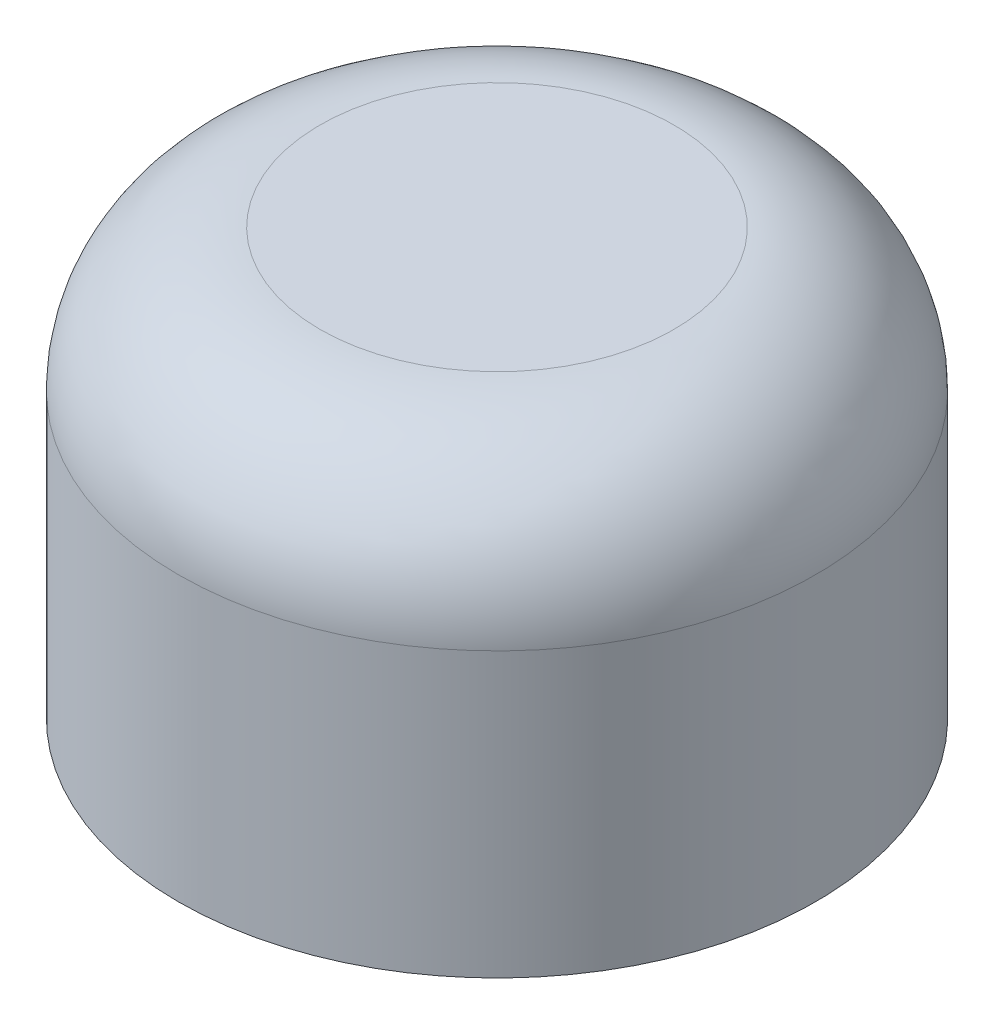
ISO-10303-21;
HEADER;
FILE_DESCRIPTION(('STEP AP214'),'2;1');
FILE_NAME('part.step','',(''),(''),'','','');
FILE_SCHEMA(('AUTOMOTIVE_DESIGN { 1 0 10303 214 1 1 1 1 }'));
ENDSEC;
DATA;
#1=APPLICATION_CONTEXT('core data for automotive mechanical design processes');
#2=APPLICATION_PROTOCOL_DEFINITION('international standard','automotive_design',2000,#1);
#3=PRODUCT_CONTEXT('',#1,'mechanical');
#4=PRODUCT('Part','Part','',(#3));
#5=PRODUCT_RELATED_PRODUCT_CATEGORY('part','',(#4));
#6=PRODUCT_DEFINITION_FORMATION('','',#4);
#7=PRODUCT_DEFINITION_CONTEXT('part definition',#1,'design');
#8=PRODUCT_DEFINITION('design','',#6,#7);
#9=PRODUCT_DEFINITION_SHAPE('','',#8);
#10=(LENGTH_UNIT() NAMED_UNIT(*) SI_UNIT(.MILLI.,.METRE.));
#11=(NAMED_UNIT(*) PLANE_ANGLE_UNIT() SI_UNIT($,.RADIAN.));
#12=(NAMED_UNIT(*) SI_UNIT($,.STERADIAN.) SOLID_ANGLE_UNIT());
#13=UNCERTAINTY_MEASURE_WITH_UNIT(LENGTH_MEASURE(1.E-05),#10,'distance_accuracy_value','');
#14=(GEOMETRIC_REPRESENTATION_CONTEXT(3) GLOBAL_UNCERTAINTY_ASSIGNED_CONTEXT((#13)) GLOBAL_UNIT_ASSIGNED_CONTEXT((#10,
#11,#12)) REPRESENTATION_CONTEXT('',''));
#15=CARTESIAN_POINT('',(0.,0.,0.));
#16=DIRECTION('',(0.,0.,1.));
#17=DIRECTION('',(1.,0.,0.));
#18=AXIS2_PLACEMENT_3D('',#15,#16,#17);
#19=CARTESIAN_POINT('',(0.,15.,0.));
#20=DIRECTION('',(0.,-1.,0.));
#21=DIRECTION('',(0.,0.,-1.));
#22=AXIS2_PLACEMENT_3D('',#19,#20,#21);
#23=CYLINDRICAL_SURFACE('',#22,11.25);
#24=CARTESIAN_POINT('',(0.,10.,0.));
#25=DIRECTION('',(0.,1.,0.));
#26=DIRECTION('',(0.,0.,1.));
#27=AXIS2_PLACEMENT_3D('',#24,#25,#26);
#28=CIRCLE('',#27,11.25);
#29=CARTESIAN_POINT('',(0.,10.,11.25));
#30=VERTEX_POINT('',#29);
#31=EDGE_CURVE('E11',#30,#30,#28,.F.);
#32=ORIENTED_EDGE('',*,*,#31,.T.);
#33=EDGE_LOOP('',(#32));
#34=FACE_BOUND('',#33,.T.);
#35=CARTESIAN_POINT('',(0.,0.,0.));
#36=DIRECTION('',(0.,1.,0.));
#37=DIRECTION('',(0.,0.,1.));
#38=AXIS2_PLACEMENT_3D('',#35,#36,#37);
#39=CIRCLE('',#38,11.25);
#40=CARTESIAN_POINT('',(0.,0.,11.25));
#41=VERTEX_POINT('',#40);
#42=EDGE_CURVE('E111',#41,#41,#39,.T.);
#43=ORIENTED_EDGE('',*,*,#42,.T.);
#44=EDGE_LOOP('',(#43));
#45=FACE_BOUND('',#44,.T.);
#46=ADVANCED_FACE('F35',(#34,#45),#23,.T.);
#47=CARTESIAN_POINT('',(0.,15.,0.));
#48=DIRECTION('',(0.,1.,0.));
#49=DIRECTION('',(0.,0.,1.));
#50=AXIS2_PLACEMENT_3D('',#47,#48,#49);
#51=PLANE('',#50);
#52=CARTESIAN_POINT('',(0.,15.,0.));
#53=DIRECTION('',(0.,1.,0.));
#54=DIRECTION('',(0.,0.,1.));
#55=AXIS2_PLACEMENT_3D('',#52,#53,#54);
#56=CIRCLE('',#55,6.25);
#57=CARTESIAN_POINT('',(0.,15.,6.25));
#58=VERTEX_POINT('',#57);
#59=EDGE_CURVE('E43',#58,#58,#56,.T.);
#60=ORIENTED_EDGE('',*,*,#59,.T.);
#61=EDGE_LOOP('',(#60));
#62=FACE_BOUND('',#61,.T.);
#63=ADVANCED_FACE('F118',(#62),#51,.T.);
#64=CARTESIAN_POINT('',(0.,0.,0.));
#65=DIRECTION('',(0.,1.,0.));
#66=DIRECTION('',(0.,0.,1.));
#67=AXIS2_PLACEMENT_3D('',#64,#65,#66);
#68=PLANE('',#67);
#69=DIRECTION('',(-1.,0.,0.));
#70=VECTOR('',#69,1.);
#71=CARTESIAN_POINT('',(-3.65,0.,3.65));
#72=LINE('',#71,#70);
#73=CARTESIAN_POINT('',(3.65,0.,3.65));
#74=VERTEX_POINT('',#73);
#75=CARTESIAN_POINT('',(-3.65,0.,3.65));
#76=VERTEX_POINT('',#75);
#77=EDGE_CURVE('E85',#74,#76,#72,.T.);
#78=ORIENTED_EDGE('',*,*,#77,.F.);
#79=DIRECTION('',(0.,0.,1.));
#80=VECTOR('',#79,1.);
#81=CARTESIAN_POINT('',(3.65,0.,-3.65));
#82=LINE('',#81,#80);
#83=CARTESIAN_POINT('',(3.65,0.,-3.65));
#84=VERTEX_POINT('',#83);
#85=EDGE_CURVE('E50',#84,#74,#82,.T.);
#86=ORIENTED_EDGE('',*,*,#85,.F.);
#87=DIRECTION('',(1.,0.,0.));
#88=VECTOR('',#87,1.);
#89=CARTESIAN_POINT('',(-3.65,0.,-3.65));
#90=LINE('',#89,#88);
#91=CARTESIAN_POINT('',(-3.65,0.,-3.65));
#92=VERTEX_POINT('',#91);
#93=EDGE_CURVE('E101',#92,#84,#90,.T.);
#94=ORIENTED_EDGE('',*,*,#93,.F.);
#95=DIRECTION('',(0.,0.,-1.));
#96=VECTOR('',#95,1.);
#97=CARTESIAN_POINT('',(-3.65,0.,-3.65));
#98=LINE('',#97,#96);
#99=EDGE_CURVE('E107',#76,#92,#98,.T.);
#100=ORIENTED_EDGE('',*,*,#99,.F.);
#101=EDGE_LOOP('',(#78,#86,#94,#100));
#102=FACE_BOUND('',#101,.T.);
#103=ORIENTED_EDGE('',*,*,#42,.F.);
#104=EDGE_LOOP('',(#103));
#105=FACE_BOUND('',#104,.T.);
#106=ADVANCED_FACE('F122',(#102,#105),#68,.F.);
#107=CARTESIAN_POINT('',(0.,10.,0.));
#108=DIRECTION('',(0.,1.,0.));
#109=DIRECTION('',(0.,0.,1.));
#110=AXIS2_PLACEMENT_3D('',#107,#108,#109);
#111=TOROIDAL_SURFACE('',#110,6.25,5.);
#112=ORIENTED_EDGE('',*,*,#31,.F.);
#113=EDGE_LOOP('',(#112));
#114=FACE_BOUND('',#113,.T.);
#115=ORIENTED_EDGE('',*,*,#59,.F.);
#116=EDGE_LOOP('',(#115));
#117=FACE_BOUND('',#116,.T.);
#118=ADVANCED_FACE('F37',(#114,#117),#111,.T.);
#119=CARTESIAN_POINT('',(3.65,8.,-3.65));
#120=DIRECTION('',(1.,0.,0.));
#121=DIRECTION('',(0.,0.,-1.));
#122=AXIS2_PLACEMENT_3D('',#119,#120,#121);
#123=PLANE('',#122);
#124=ORIENTED_EDGE('',*,*,#85,.T.);
#125=DIRECTION('',(0.,-1.,0.));
#126=VECTOR('',#125,1.);
#127=CARTESIAN_POINT('',(3.65,8.,3.65));
#128=LINE('',#127,#126);
#129=CARTESIAN_POINT('',(3.65,8.,3.65));
#130=VERTEX_POINT('',#129);
#131=EDGE_CURVE('E73',#130,#74,#128,.T.);
#132=ORIENTED_EDGE('',*,*,#131,.F.);
#133=DIRECTION('',(0.,0.,1.));
#134=VECTOR('',#133,1.);
#135=CARTESIAN_POINT('',(3.65,8.,-3.65));
#136=LINE('',#135,#134);
#137=CARTESIAN_POINT('',(3.65,8.,-3.65));
#138=VERTEX_POINT('',#137);
#139=EDGE_CURVE('E99',#138,#130,#136,.T.);
#140=ORIENTED_EDGE('',*,*,#139,.F.);
#141=DIRECTION('',(0.,-1.,0.));
#142=VECTOR('',#141,1.);
#143=CARTESIAN_POINT('',(3.65,8.,-3.65));
#144=LINE('',#143,#142);
#145=EDGE_CURVE('E58',#138,#84,#144,.T.);
#146=ORIENTED_EDGE('',*,*,#145,.T.);
#147=EDGE_LOOP('',(#124,#132,#140,#146));
#148=FACE_BOUND('',#147,.T.);
#149=ADVANCED_FACE('F121',(#148),#123,.F.);
#150=CARTESIAN_POINT('',(-3.65,8.,-3.65));
#151=DIRECTION('',(0.,0.,-1.));
#152=DIRECTION('',(-1.,0.,0.));
#153=AXIS2_PLACEMENT_3D('',#150,#151,#152);
#154=PLANE('',#153);
#155=ORIENTED_EDGE('',*,*,#93,.T.);
#156=ORIENTED_EDGE('',*,*,#145,.F.);
#157=DIRECTION('',(1.,0.,0.));
#158=VECTOR('',#157,1.);
#159=CARTESIAN_POINT('',(-3.65,8.,-3.65));
#160=LINE('',#159,#158);
#161=CARTESIAN_POINT('',(-3.65,8.,-3.65));
#162=VERTEX_POINT('',#161);
#163=EDGE_CURVE('E96',#162,#138,#160,.T.);
#164=ORIENTED_EDGE('',*,*,#163,.F.);
#165=DIRECTION('',(0.,-1.,0.));
#166=VECTOR('',#165,1.);
#167=CARTESIAN_POINT('',(-3.65,8.,-3.65));
#168=LINE('',#167,#166);
#169=EDGE_CURVE('E89',#162,#92,#168,.T.);
#170=ORIENTED_EDGE('',*,*,#169,.T.);
#171=EDGE_LOOP('',(#155,#156,#164,#170));
#172=FACE_BOUND('',#171,.T.);
#173=ADVANCED_FACE('F128',(#172),#154,.F.);
#174=CARTESIAN_POINT('',(-3.65,8.,-3.65));
#175=DIRECTION('',(-1.,0.,0.));
#176=DIRECTION('',(0.,0.,1.));
#177=AXIS2_PLACEMENT_3D('',#174,#175,#176);
#178=PLANE('',#177);
#179=ORIENTED_EDGE('',*,*,#99,.T.);
#180=ORIENTED_EDGE('',*,*,#169,.F.);
#181=DIRECTION('',(0.,0.,-1.));
#182=VECTOR('',#181,1.);
#183=CARTESIAN_POINT('',(-3.65,8.,-3.65));
#184=LINE('',#183,#182);
#185=CARTESIAN_POINT('',(-3.65,8.,3.65));
#186=VERTEX_POINT('',#185);
#187=EDGE_CURVE('E92',#186,#162,#184,.T.);
#188=ORIENTED_EDGE('',*,*,#187,.F.);
#189=DIRECTION('',(0.,-1.,0.));
#190=VECTOR('',#189,1.);
#191=CARTESIAN_POINT('',(-3.65,8.,3.65));
#192=LINE('',#191,#190);
#193=EDGE_CURVE('E78',#186,#76,#192,.T.);
#194=ORIENTED_EDGE('',*,*,#193,.T.);
#195=EDGE_LOOP('',(#179,#180,#188,#194));
#196=FACE_BOUND('',#195,.T.);
#197=ADVANCED_FACE('F93',(#196),#178,.F.);
#198=CARTESIAN_POINT('',(-3.65,8.,3.65));
#199=DIRECTION('',(0.,0.,1.));
#200=DIRECTION('',(1.,0.,0.));
#201=AXIS2_PLACEMENT_3D('',#198,#199,#200);
#202=PLANE('',#201);
#203=ORIENTED_EDGE('',*,*,#77,.T.);
#204=ORIENTED_EDGE('',*,*,#193,.F.);
#205=DIRECTION('',(-1.,0.,0.));
#206=VECTOR('',#205,1.);
#207=CARTESIAN_POINT('',(-3.65,8.,3.65));
#208=LINE('',#207,#206);
#209=EDGE_CURVE('E82',#130,#186,#208,.T.);
#210=ORIENTED_EDGE('',*,*,#209,.F.);
#211=ORIENTED_EDGE('',*,*,#131,.T.);
#212=EDGE_LOOP('',(#203,#204,#210,#211));
#213=FACE_BOUND('',#212,.T.);
#214=ADVANCED_FACE('F80',(#213),#202,.F.);
#215=CARTESIAN_POINT('',(0.,8.,0.));
#216=DIRECTION('',(0.,1.,0.));
#217=DIRECTION('',(0.,0.,1.));
#218=AXIS2_PLACEMENT_3D('',#215,#216,#217);
#219=PLANE('',#218);
#220=ORIENTED_EDGE('',*,*,#139,.T.);
#221=ORIENTED_EDGE('',*,*,#209,.T.);
#222=ORIENTED_EDGE('',*,*,#187,.T.);
#223=ORIENTED_EDGE('',*,*,#163,.T.);
#224=EDGE_LOOP('',(#220,#221,#222,#223));
#225=FACE_BOUND('',#224,.T.);
#226=ADVANCED_FACE('F98',(#225),#219,.F.);
#227=CLOSED_SHELL('',(#46,#63,#106,#118,#149,#173,#197,#214,#226));
#228=MANIFOLD_SOLID_BREP('B2',#227);
#229=ADVANCED_BREP_SHAPE_REPRESENTATION('',(#18,#228),#14);
#230=SHAPE_DEFINITION_REPRESENTATION(#9,#229);
ENDSEC;
END-ISO-10303-21;
